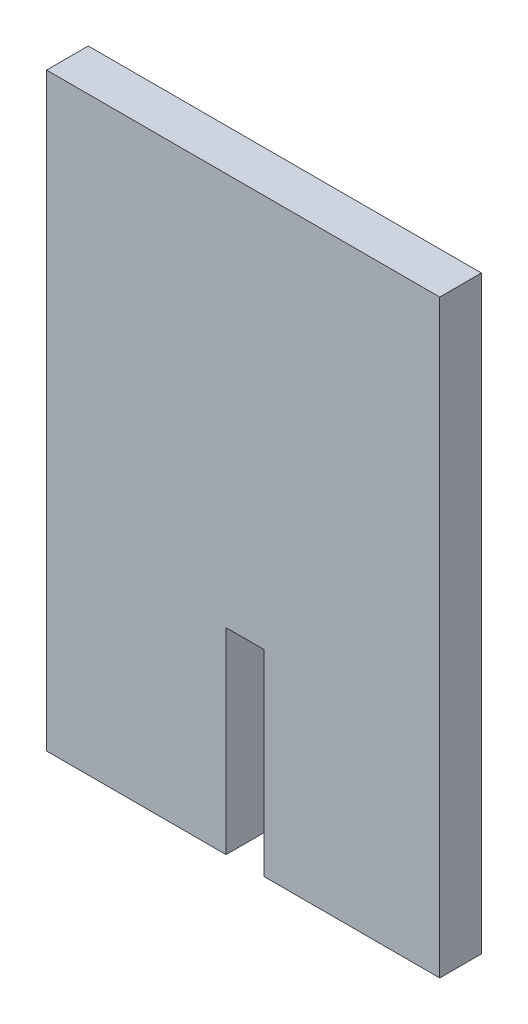
ISO-10303-21;
HEADER;
FILE_DESCRIPTION(('STEP AP214'),'2;1');
FILE_NAME('part.step','',(''),(''),'','','');
FILE_SCHEMA(('AUTOMOTIVE_DESIGN { 1 0 10303 214 1 1 1 1 }'));
ENDSEC;
DATA;
#1=APPLICATION_CONTEXT('core data for automotive mechanical design processes');
#2=APPLICATION_PROTOCOL_DEFINITION('international standard','automotive_design',2000,#1);
#3=PRODUCT_CONTEXT('',#1,'mechanical');
#4=PRODUCT('Part','Part','',(#3));
#5=PRODUCT_RELATED_PRODUCT_CATEGORY('part','',(#4));
#6=PRODUCT_DEFINITION_FORMATION('','',#4);
#7=PRODUCT_DEFINITION_CONTEXT('part definition',#1,'design');
#8=PRODUCT_DEFINITION('design','',#6,#7);
#9=PRODUCT_DEFINITION_SHAPE('','',#8);
#10=(LENGTH_UNIT() NAMED_UNIT(*) SI_UNIT(.MILLI.,.METRE.));
#11=(NAMED_UNIT(*) PLANE_ANGLE_UNIT() SI_UNIT($,.RADIAN.));
#12=(NAMED_UNIT(*) SI_UNIT($,.STERADIAN.) SOLID_ANGLE_UNIT());
#13=UNCERTAINTY_MEASURE_WITH_UNIT(LENGTH_MEASURE(1.E-05),#10,'distance_accuracy_value','');
#14=(GEOMETRIC_REPRESENTATION_CONTEXT(3) GLOBAL_UNCERTAINTY_ASSIGNED_CONTEXT((#13)) GLOBAL_UNIT_ASSIGNED_CONTEXT((#10,
#11,#12)) REPRESENTATION_CONTEXT('',''));
#15=CARTESIAN_POINT('',(0.,0.,0.));
#16=DIRECTION('',(0.,0.,1.));
#17=DIRECTION('',(1.,0.,0.));
#18=AXIS2_PLACEMENT_3D('',#15,#16,#17);
#19=CARTESIAN_POINT('',(12.7,-19.05,2.6924));
#20=DIRECTION('',(-1.,0.,0.));
#21=DIRECTION('',(0.,0.,1.));
#22=AXIS2_PLACEMENT_3D('',#19,#20,#21);
#23=PLANE('',#22);
#24=DIRECTION('',(0.,1.,0.));
#25=VECTOR('',#24,1.);
#26=CARTESIAN_POINT('',(12.7,-19.05,0.));
#27=LINE('',#26,#25);
#28=CARTESIAN_POINT('',(12.7,-19.05,0.));
#29=VERTEX_POINT('',#28);
#30=CARTESIAN_POINT('',(12.7,19.05,0.));
#31=VERTEX_POINT('',#30);
#32=EDGE_CURVE('E133',#29,#31,#27,.T.);
#33=ORIENTED_EDGE('',*,*,#32,.T.);
#34=DIRECTION('',(0.,0.,-1.));
#35=VECTOR('',#34,1.);
#36=CARTESIAN_POINT('',(12.7,19.05,2.6924));
#37=LINE('',#36,#35);
#38=CARTESIAN_POINT('',(12.7,19.05,2.6924));
#39=VERTEX_POINT('',#38);
#40=EDGE_CURVE('E11',#39,#31,#37,.T.);
#41=ORIENTED_EDGE('',*,*,#40,.F.);
#42=DIRECTION('',(0.,1.,0.));
#43=VECTOR('',#42,1.);
#44=CARTESIAN_POINT('',(12.7,-19.05,2.6924));
#45=LINE('',#44,#43);
#46=CARTESIAN_POINT('',(12.7,-19.05,2.6924));
#47=VERTEX_POINT('',#46);
#48=EDGE_CURVE('E149',#47,#39,#45,.T.);
#49=ORIENTED_EDGE('',*,*,#48,.F.);
#50=DIRECTION('',(0.,0.,-1.));
#51=VECTOR('',#50,1.);
#52=CARTESIAN_POINT('',(12.7,-19.05,2.6924));
#53=LINE('',#52,#51);
#54=EDGE_CURVE('E132',#47,#29,#53,.T.);
#55=ORIENTED_EDGE('',*,*,#54,.T.);
#56=EDGE_LOOP('',(#33,#41,#49,#55));
#57=FACE_BOUND('',#56,.T.);
#58=ADVANCED_FACE('F39',(#57),#23,.F.);
#59=CARTESIAN_POINT('',(-12.7,19.05,2.6924));
#60=DIRECTION('',(0.,-1.,0.));
#61=DIRECTION('',(0.,0.,-1.));
#62=AXIS2_PLACEMENT_3D('',#59,#60,#61);
#63=PLANE('',#62);
#64=DIRECTION('',(-1.,0.,0.));
#65=VECTOR('',#64,1.);
#66=CARTESIAN_POINT('',(-12.7,19.05,0.));
#67=LINE('',#66,#65);
#68=CARTESIAN_POINT('',(-12.7,19.05,0.));
#69=VERTEX_POINT('',#68);
#70=EDGE_CURVE('E137',#31,#69,#67,.T.);
#71=ORIENTED_EDGE('',*,*,#70,.T.);
#72=DIRECTION('',(0.,0.,-1.));
#73=VECTOR('',#72,1.);
#74=CARTESIAN_POINT('',(-12.7,19.05,2.6924));
#75=LINE('',#74,#73);
#76=CARTESIAN_POINT('',(-12.7,19.05,2.6924));
#77=VERTEX_POINT('',#76);
#78=EDGE_CURVE('E50',#77,#69,#75,.T.);
#79=ORIENTED_EDGE('',*,*,#78,.F.);
#80=DIRECTION('',(-1.,0.,0.));
#81=VECTOR('',#80,1.);
#82=CARTESIAN_POINT('',(-12.7,19.05,2.6924));
#83=LINE('',#82,#81);
#84=EDGE_CURVE('E98',#39,#77,#83,.T.);
#85=ORIENTED_EDGE('',*,*,#84,.F.);
#86=ORIENTED_EDGE('',*,*,#40,.T.);
#87=EDGE_LOOP('',(#71,#79,#85,#86));
#88=FACE_BOUND('',#87,.T.);
#89=ADVANCED_FACE('F184',(#88),#63,.F.);
#90=CARTESIAN_POINT('',(-12.7,-19.05,2.6924));
#91=DIRECTION('',(1.,0.,0.));
#92=DIRECTION('',(0.,0.,-1.));
#93=AXIS2_PLACEMENT_3D('',#90,#91,#92);
#94=PLANE('',#93);
#95=DIRECTION('',(0.,-1.,0.));
#96=VECTOR('',#95,1.);
#97=CARTESIAN_POINT('',(-12.7,-19.05,0.));
#98=LINE('',#97,#96);
#99=CARTESIAN_POINT('',(-12.7,-19.05,0.));
#100=VERTEX_POINT('',#99);
#101=EDGE_CURVE('E139',#69,#100,#98,.T.);
#102=ORIENTED_EDGE('',*,*,#101,.T.);
#103=DIRECTION('',(0.,0.,-1.));
#104=VECTOR('',#103,1.);
#105=CARTESIAN_POINT('',(-12.7,-19.05,2.6924));
#106=LINE('',#105,#104);
#107=CARTESIAN_POINT('',(-12.7,-19.05,2.6924));
#108=VERTEX_POINT('',#107);
#109=EDGE_CURVE('E156',#108,#100,#106,.T.);
#110=ORIENTED_EDGE('',*,*,#109,.F.);
#111=DIRECTION('',(0.,-1.,0.));
#112=VECTOR('',#111,1.);
#113=CARTESIAN_POINT('',(-12.7,-19.05,2.6924));
#114=LINE('',#113,#112);
#115=EDGE_CURVE('E163',#77,#108,#114,.T.);
#116=ORIENTED_EDGE('',*,*,#115,.F.);
#117=ORIENTED_EDGE('',*,*,#78,.T.);
#118=EDGE_LOOP('',(#102,#110,#116,#117));
#119=FACE_BOUND('',#118,.T.);
#120=ADVANCED_FACE('F165',(#119),#94,.F.);
#121=CARTESIAN_POINT('',(-12.7,-19.05,2.6924));
#122=DIRECTION('',(0.,1.,0.));
#123=DIRECTION('',(-1.,0.,0.));
#124=AXIS2_PLACEMENT_3D('',#121,#122,#123);
#125=PLANE('',#124);
#126=DIRECTION('',(1.,0.,0.));
#127=VECTOR('',#126,1.);
#128=CARTESIAN_POINT('',(-12.7,-19.05,0.));
#129=LINE('',#128,#127);
#130=CARTESIAN_POINT('',(-1.1049,-19.05,0.));
#131=VERTEX_POINT('',#130);
#132=EDGE_CURVE('E142',#100,#131,#129,.T.);
#133=ORIENTED_EDGE('',*,*,#132,.T.);
#134=DIRECTION('',(0.,0.,-1.));
#135=VECTOR('',#134,1.);
#136=CARTESIAN_POINT('',(-1.1049,-19.05,2.6924));
#137=LINE('',#136,#135);
#138=CARTESIAN_POINT('',(-1.1049,-19.05,2.6924));
#139=VERTEX_POINT('',#138);
#140=EDGE_CURVE('E153',#139,#131,#137,.T.);
#141=ORIENTED_EDGE('',*,*,#140,.F.);
#142=DIRECTION('',(1.,0.,0.));
#143=VECTOR('',#142,1.);
#144=CARTESIAN_POINT('',(-12.7,-19.05,2.6924));
#145=LINE('',#144,#143);
#146=EDGE_CURVE('E176',#108,#139,#145,.T.);
#147=ORIENTED_EDGE('',*,*,#146,.F.);
#148=ORIENTED_EDGE('',*,*,#109,.T.);
#149=EDGE_LOOP('',(#133,#141,#147,#148));
#150=FACE_BOUND('',#149,.T.);
#151=ADVANCED_FACE('F175',(#150),#125,.F.);
#152=CARTESIAN_POINT('',(-1.1049,-19.05,2.6924));
#153=DIRECTION('',(-1.,0.,0.));
#154=DIRECTION('',(0.,0.,1.));
#155=AXIS2_PLACEMENT_3D('',#152,#153,#154);
#156=PLANE('',#155);
#157=DIRECTION('',(0.,1.,0.));
#158=VECTOR('',#157,1.);
#159=CARTESIAN_POINT('',(-1.1049,-19.05,0.));
#160=LINE('',#159,#158);
#161=CARTESIAN_POINT('',(-1.1049,-6.35,0.));
#162=VERTEX_POINT('',#161);
#163=EDGE_CURVE('E145',#131,#162,#160,.T.);
#164=ORIENTED_EDGE('',*,*,#163,.T.);
#165=DIRECTION('',(0.,0.,-1.));
#166=VECTOR('',#165,1.);
#167=CARTESIAN_POINT('',(-1.1049,-6.35,2.6924));
#168=LINE('',#167,#166);
#169=CARTESIAN_POINT('',(-1.1049,-6.35,2.6924));
#170=VERTEX_POINT('',#169);
#171=EDGE_CURVE('E127',#170,#162,#168,.T.);
#172=ORIENTED_EDGE('',*,*,#171,.F.);
#173=DIRECTION('',(0.,1.,0.));
#174=VECTOR('',#173,1.);
#175=CARTESIAN_POINT('',(-1.1049,-19.05,2.6924));
#176=LINE('',#175,#174);
#177=EDGE_CURVE('E120',#139,#170,#176,.T.);
#178=ORIENTED_EDGE('',*,*,#177,.F.);
#179=ORIENTED_EDGE('',*,*,#140,.T.);
#180=EDGE_LOOP('',(#164,#172,#178,#179));
#181=FACE_BOUND('',#180,.T.);
#182=ADVANCED_FACE('F173',(#181),#156,.F.);
#183=CARTESIAN_POINT('',(-1.1049,-6.35,2.6924));
#184=DIRECTION('',(0.,1.,0.));
#185=DIRECTION('',(0.,0.,1.));
#186=AXIS2_PLACEMENT_3D('',#183,#184,#185);
#187=PLANE('',#186);
#188=DIRECTION('',(1.,0.,0.));
#189=VECTOR('',#188,1.);
#190=CARTESIAN_POINT('',(-1.1049,-6.35,0.));
#191=LINE('',#190,#189);
#192=CARTESIAN_POINT('',(1.3335,-6.35,0.));
#193=VERTEX_POINT('',#192);
#194=EDGE_CURVE('E124',#162,#193,#191,.T.);
#195=ORIENTED_EDGE('',*,*,#194,.T.);
#196=DIRECTION('',(0.,0.,-1.));
#197=VECTOR('',#196,1.);
#198=CARTESIAN_POINT('',(1.3335,-6.35,2.6924));
#199=LINE('',#198,#197);
#200=CARTESIAN_POINT('',(1.3335,-6.35,2.6924));
#201=VERTEX_POINT('',#200);
#202=EDGE_CURVE('E125',#201,#193,#199,.T.);
#203=ORIENTED_EDGE('',*,*,#202,.F.);
#204=DIRECTION('',(1.,0.,0.));
#205=VECTOR('',#204,1.);
#206=CARTESIAN_POINT('',(-1.1049,-6.35,2.6924));
#207=LINE('',#206,#205);
#208=EDGE_CURVE('E112',#170,#201,#207,.T.);
#209=ORIENTED_EDGE('',*,*,#208,.F.);
#210=ORIENTED_EDGE('',*,*,#171,.T.);
#211=EDGE_LOOP('',(#195,#203,#209,#210));
#212=FACE_BOUND('',#211,.T.);
#213=ADVANCED_FACE('F122',(#212),#187,.F.);
#214=CARTESIAN_POINT('',(1.3335,-19.05,2.6924));
#215=DIRECTION('',(1.,0.,0.));
#216=DIRECTION('',(0.,0.,-1.));
#217=AXIS2_PLACEMENT_3D('',#214,#215,#216);
#218=PLANE('',#217);
#219=DIRECTION('',(0.,-1.,0.));
#220=VECTOR('',#219,1.);
#221=CARTESIAN_POINT('',(1.3335,-19.05,0.));
#222=LINE('',#221,#220);
#223=CARTESIAN_POINT('',(1.3335,-19.05,0.));
#224=VERTEX_POINT('',#223);
#225=EDGE_CURVE('E83',#193,#224,#222,.T.);
#226=ORIENTED_EDGE('',*,*,#225,.T.);
#227=DIRECTION('',(0.,0.,-1.));
#228=VECTOR('',#227,1.);
#229=CARTESIAN_POINT('',(1.3335,-19.05,2.6924));
#230=LINE('',#229,#228);
#231=CARTESIAN_POINT('',(1.3335,-19.05,2.6924));
#232=VERTEX_POINT('',#231);
#233=EDGE_CURVE('E130',#232,#224,#230,.T.);
#234=ORIENTED_EDGE('',*,*,#233,.F.);
#235=DIRECTION('',(0.,-1.,0.));
#236=VECTOR('',#235,1.);
#237=CARTESIAN_POINT('',(1.3335,-19.05,2.6924));
#238=LINE('',#237,#236);
#239=EDGE_CURVE('E113',#201,#232,#238,.T.);
#240=ORIENTED_EDGE('',*,*,#239,.F.);
#241=ORIENTED_EDGE('',*,*,#202,.T.);
#242=EDGE_LOOP('',(#226,#234,#240,#241));
#243=FACE_BOUND('',#242,.T.);
#244=ADVANCED_FACE('F129',(#243),#218,.F.);
#245=CARTESIAN_POINT('',(1.3335,-19.05,2.6924));
#246=DIRECTION('',(0.,1.,0.));
#247=DIRECTION('',(0.,0.,1.));
#248=AXIS2_PLACEMENT_3D('',#245,#246,#247);
#249=PLANE('',#248);
#250=DIRECTION('',(1.,0.,0.));
#251=VECTOR('',#250,1.);
#252=CARTESIAN_POINT('',(1.3335,-19.05,0.));
#253=LINE('',#252,#251);
#254=EDGE_CURVE('E89',#224,#29,#253,.T.);
#255=ORIENTED_EDGE('',*,*,#254,.T.);
#256=ORIENTED_EDGE('',*,*,#54,.F.);
#257=DIRECTION('',(1.,0.,0.));
#258=VECTOR('',#257,1.);
#259=CARTESIAN_POINT('',(1.3335,-19.05,2.6924));
#260=LINE('',#259,#258);
#261=EDGE_CURVE('E54',#232,#47,#260,.T.);
#262=ORIENTED_EDGE('',*,*,#261,.F.);
#263=ORIENTED_EDGE('',*,*,#233,.T.);
#264=EDGE_LOOP('',(#255,#256,#262,#263));
#265=FACE_BOUND('',#264,.T.);
#266=ADVANCED_FACE('F199',(#265),#249,.F.);
#267=CARTESIAN_POINT('',(0.,0.,2.6924));
#268=DIRECTION('',(0.,0.,-1.));
#269=DIRECTION('',(-1.,0.,0.));
#270=AXIS2_PLACEMENT_3D('',#267,#268,#269);
#271=PLANE('',#270);
#272=ORIENTED_EDGE('',*,*,#48,.T.);
#273=ORIENTED_EDGE('',*,*,#84,.T.);
#274=ORIENTED_EDGE('',*,*,#115,.T.);
#275=ORIENTED_EDGE('',*,*,#146,.T.);
#276=ORIENTED_EDGE('',*,*,#177,.T.);
#277=ORIENTED_EDGE('',*,*,#208,.T.);
#278=ORIENTED_EDGE('',*,*,#239,.T.);
#279=ORIENTED_EDGE('',*,*,#261,.T.);
#280=EDGE_LOOP('',(#272,#273,#274,#275,#276,#277,#278,#279));
#281=FACE_BOUND('',#280,.T.);
#282=ADVANCED_FACE('F114',(#281),#271,.F.);
#283=CARTESIAN_POINT('',(0.,0.,0.));
#284=DIRECTION('',(0.,0.,-1.));
#285=DIRECTION('',(-1.,0.,0.));
#286=AXIS2_PLACEMENT_3D('',#283,#284,#285);
#287=PLANE('',#286);
#288=ORIENTED_EDGE('',*,*,#32,.F.);
#289=ORIENTED_EDGE('',*,*,#254,.F.);
#290=ORIENTED_EDGE('',*,*,#225,.F.);
#291=ORIENTED_EDGE('',*,*,#194,.F.);
#292=ORIENTED_EDGE('',*,*,#163,.F.);
#293=ORIENTED_EDGE('',*,*,#132,.F.);
#294=ORIENTED_EDGE('',*,*,#101,.F.);
#295=ORIENTED_EDGE('',*,*,#70,.F.);
#296=EDGE_LOOP('',(#288,#289,#290,#291,#292,#293,#294,#295));
#297=FACE_BOUND('',#296,.T.);
#298=ADVANCED_FACE('F169',(#297),#287,.T.);
#299=CLOSED_SHELL('',(#58,#89,#120,#151,#182,#213,#244,#266,#282,#298));
#300=MANIFOLD_SOLID_BREP('B2',#299);
#301=ADVANCED_BREP_SHAPE_REPRESENTATION('',(#18,#300),#14);
#302=SHAPE_DEFINITION_REPRESENTATION(#9,#301);
ENDSEC;
END-ISO-10303-21;
